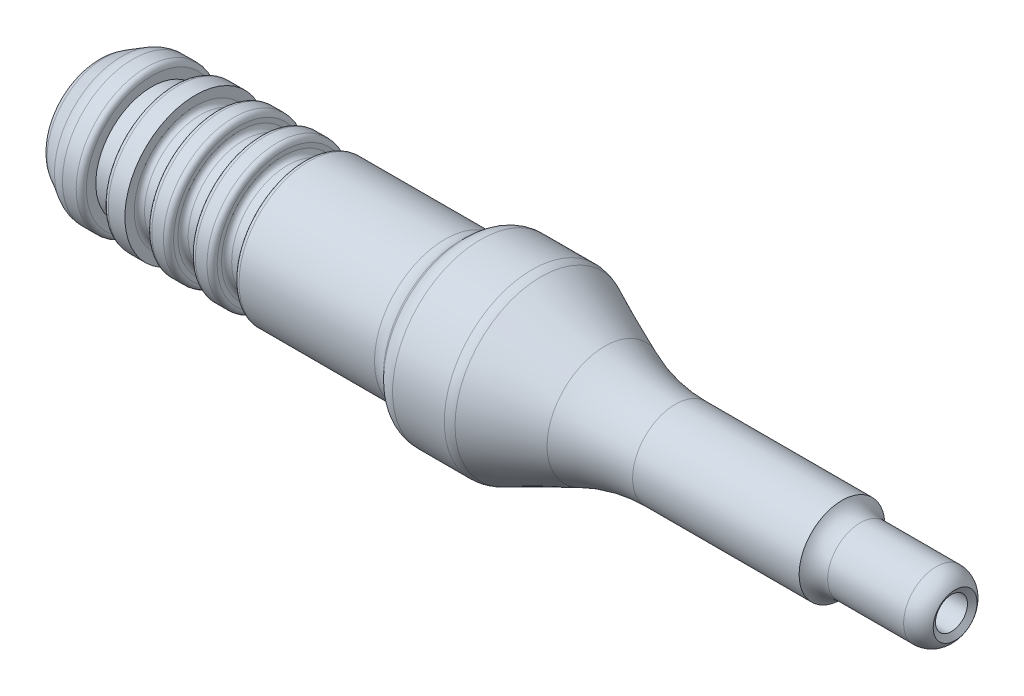
ISO-10303-21;
HEADER;
FILE_DESCRIPTION(('STEP AP214'),'2;1');
FILE_NAME('part.step','',(''),(''),'','','');
FILE_SCHEMA(('AUTOMOTIVE_DESIGN { 1 0 10303 214 1 1 1 1 }'));
ENDSEC;
DATA;
#1=APPLICATION_CONTEXT('core data for automotive mechanical design processes');
#2=APPLICATION_PROTOCOL_DEFINITION('international standard','automotive_design',2000,#1);
#3=PRODUCT_CONTEXT('',#1,'mechanical');
#4=PRODUCT('Part','Part','',(#3));
#5=PRODUCT_RELATED_PRODUCT_CATEGORY('part','',(#4));
#6=PRODUCT_DEFINITION_FORMATION('','',#4);
#7=PRODUCT_DEFINITION_CONTEXT('part definition',#1,'design');
#8=PRODUCT_DEFINITION('design','',#6,#7);
#9=PRODUCT_DEFINITION_SHAPE('','',#8);
#10=(LENGTH_UNIT() NAMED_UNIT(*) SI_UNIT(.MILLI.,.METRE.));
#11=(NAMED_UNIT(*) PLANE_ANGLE_UNIT() SI_UNIT($,.RADIAN.));
#12=(NAMED_UNIT(*) SI_UNIT($,.STERADIAN.) SOLID_ANGLE_UNIT());
#13=UNCERTAINTY_MEASURE_WITH_UNIT(LENGTH_MEASURE(1.E-05),#10,'distance_accuracy_value','');
#14=(GEOMETRIC_REPRESENTATION_CONTEXT(3) GLOBAL_UNCERTAINTY_ASSIGNED_CONTEXT((#13)) GLOBAL_UNIT_ASSIGNED_CONTEXT((#10,
#11,#12)) REPRESENTATION_CONTEXT('',''));
#15=CARTESIAN_POINT('',(0.,0.,0.));
#16=DIRECTION('',(0.,0.,1.));
#17=DIRECTION('',(1.,0.,0.));
#18=AXIS2_PLACEMENT_3D('',#15,#16,#17);
#19=CARTESIAN_POINT('',(0.,0.,0.));
#20=DIRECTION('',(-1.,0.,0.));
#21=DIRECTION('',(0.,0.,1.));
#22=AXIS2_PLACEMENT_3D('',#19,#20,#21);
#23=CYLINDRICAL_SURFACE('',#22,4.84790561913614);
#24=CARTESIAN_POINT('',(14.85,0.,0.));
#25=DIRECTION('',(1.,0.,0.));
#26=DIRECTION('',(0.,0.,-1.));
#27=AXIS2_PLACEMENT_3D('',#24,#25,#26);
#28=CIRCLE('',#27,4.84790561913614);
#29=CARTESIAN_POINT('',(14.85,0.,-4.84790561913614));
#30=VERTEX_POINT('',#29);
#31=EDGE_CURVE('E48',#30,#30,#28,.T.);
#32=ORIENTED_EDGE('',*,*,#31,.T.);
#33=EDGE_LOOP('',(#32));
#34=FACE_BOUND('',#33,.T.);
#35=CARTESIAN_POINT('',(24.1786796564404,0.,0.));
#36=DIRECTION('',(-1.,0.,0.));
#37=DIRECTION('',(0.,0.,1.));
#38=AXIS2_PLACEMENT_3D('',#35,#36,#37);
#39=CIRCLE('',#38,4.84790561913614);
#40=CARTESIAN_POINT('',(24.1786796564404,0.,4.84790561913614));
#41=VERTEX_POINT('',#40);
#42=EDGE_CURVE('E146',#41,#41,#39,.T.);
#43=ORIENTED_EDGE('',*,*,#42,.T.);
#44=EDGE_LOOP('',(#43));
#45=FACE_BOUND('',#44,.T.);
#46=ADVANCED_FACE('F33',(#34,#45),#23,.T.);
#47=CARTESIAN_POINT('',(26.,0.,0.));
#48=DIRECTION('',(1.,0.,0.));
#49=DIRECTION('',(0.,0.,-1.));
#50=AXIS2_PLACEMENT_3D('',#47,#48,#49);
#51=CONICAL_SURFACE('',#50,6.04790561913615,0.78539816339745);
#52=CARTESIAN_POINT('',(25.2393398282202,0.,0.));
#53=DIRECTION('',(1.,0.,0.));
#54=DIRECTION('',(0.,0.,-1.));
#55=AXIS2_PLACEMENT_3D('',#52,#53,#54);
#56=CIRCLE('',#55,5.28724544735633);
#57=CARTESIAN_POINT('',(25.2393398282202,0.,-5.28724544735633));
#58=VERTEX_POINT('',#57);
#59=EDGE_CURVE('E140',#58,#58,#56,.T.);
#60=ORIENTED_EDGE('',*,*,#59,.T.);
#61=EDGE_LOOP('',(#60));
#62=FACE_BOUND('',#61,.T.);
#63=CARTESIAN_POINT('',(25.5606601717798,0.,0.));
#64=DIRECTION('',(-1.,0.,0.));
#65=DIRECTION('',(0.,0.,1.));
#66=AXIS2_PLACEMENT_3D('',#63,#64,#65);
#67=CIRCLE('',#66,5.60856579091597);
#68=CARTESIAN_POINT('',(25.5606601717798,0.,5.60856579091597));
#69=VERTEX_POINT('',#68);
#70=EDGE_CURVE('E143',#69,#69,#67,.T.);
#71=ORIENTED_EDGE('',*,*,#70,.T.);
#72=EDGE_LOOP('',(#71));
#73=FACE_BOUND('',#72,.T.);
#74=ADVANCED_FACE('F207',(#62,#73),#51,.T.);
#75=CARTESIAN_POINT('',(0.,0.,0.));
#76=DIRECTION('',(-1.,0.,0.));
#77=DIRECTION('',(0.,0.,1.));
#78=AXIS2_PLACEMENT_3D('',#75,#76,#77);
#79=CYLINDRICAL_SURFACE('',#78,6.04790561913615);
#80=CARTESIAN_POINT('',(26.6213203435596,0.,0.));
#81=DIRECTION('',(1.,0.,0.));
#82=DIRECTION('',(0.,0.,-1.));
#83=AXIS2_PLACEMENT_3D('',#80,#81,#82);
#84=CIRCLE('',#83,6.04790561913615);
#85=CARTESIAN_POINT('',(26.6213203435596,0.,-6.04790561913615));
#86=VERTEX_POINT('',#85);
#87=EDGE_CURVE('E134',#86,#86,#84,.T.);
#88=ORIENTED_EDGE('',*,*,#87,.T.);
#89=EDGE_LOOP('',(#88));
#90=FACE_BOUND('',#89,.T.);
#91=CARTESIAN_POINT('',(30.182669802533,0.,0.));
#92=DIRECTION('',(1.,0.,0.));
#93=DIRECTION('',(0.,0.,-1.));
#94=AXIS2_PLACEMENT_3D('',#91,#92,#93);
#95=CIRCLE('',#94,6.04790561913615);
#96=CARTESIAN_POINT('',(30.182669802533,0.,-6.04790561913615));
#97=VERTEX_POINT('',#96);
#98=EDGE_CURVE('E137',#97,#97,#95,.F.);
#99=ORIENTED_EDGE('',*,*,#98,.T.);
#100=EDGE_LOOP('',(#99));
#101=FACE_BOUND('',#100,.T.);
#102=ADVANCED_FACE('F215',(#90,#101),#79,.T.);
#103=CARTESIAN_POINT('',(37.5,0.,0.));
#104=DIRECTION('',(-1.,0.,0.));
#105=DIRECTION('',(0.,0.,1.));
#106=AXIS2_PLACEMENT_3D('',#103,#104,#105);
#107=CONICAL_SURFACE('',#106,2.94739412510884,0.416959158301445);
#108=CARTESIAN_POINT('',(30.7901428223222,0.,0.));
#109=DIRECTION('',(1.,0.,0.));
#110=DIRECTION('',(0.,0.,-1.));
#111=AXIS2_PLACEMENT_3D('',#108,#109,#110);
#112=CIRCLE('',#111,5.91939259691907);
#113=CARTESIAN_POINT('',(30.7901428223222,0.,-5.91939259691907));
#114=VERTEX_POINT('',#113);
#115=EDGE_CURVE('E131',#114,#114,#112,.T.);
#116=ORIENTED_EDGE('',*,*,#115,.T.);
#117=EDGE_LOOP('',(#116));
#118=FACE_BOUND('',#117,.T.);
#119=CARTESIAN_POINT('',(35.1788574214223,0.,0.));
#120=DIRECTION('',(-1.,0.,0.));
#121=DIRECTION('',(0.,0.,1.));
#122=AXIS2_PLACEMENT_3D('',#119,#120,#121);
#123=CIRCLE('',#122,3.97549830284546);
#124=CARTESIAN_POINT('',(35.1788574214223,0.,3.97549830284546));
#125=VERTEX_POINT('',#124);
#126=EDGE_CURVE('E167',#125,#125,#123,.T.);
#127=ORIENTED_EDGE('',*,*,#126,.T.);
#128=EDGE_LOOP('',(#127));
#129=FACE_BOUND('',#128,.T.);
#130=ADVANCED_FACE('F291',(#118,#129),#107,.T.);
#131=CARTESIAN_POINT('',(0.,0.,0.));
#132=DIRECTION('',(-1.,0.,0.));
#133=DIRECTION('',(0.,0.,1.));
#134=AXIS2_PLACEMENT_3D('',#131,#132,#133);
#135=CYLINDRICAL_SURFACE('',#134,2.94739412510884);
#136=CARTESIAN_POINT('',(40.0386415797363,0.,0.));
#137=DIRECTION('',(-1.,0.,0.));
#138=DIRECTION('',(0.,0.,1.));
#139=AXIS2_PLACEMENT_3D('',#136,#137,#138);
#140=CIRCLE('',#139,2.94739412510884);
#141=CARTESIAN_POINT('',(40.0386415797363,0.,2.94739412510884));
#142=VERTEX_POINT('',#141);
#143=EDGE_CURVE('E164',#142,#142,#140,.F.);
#144=ORIENTED_EDGE('',*,*,#143,.T.);
#145=EDGE_LOOP('',(#144));
#146=FACE_BOUND('',#145,.T.);
#147=CARTESIAN_POINT('',(51.5,0.,0.));
#148=DIRECTION('',(-1.,0.,0.));
#149=DIRECTION('',(0.,0.,1.));
#150=AXIS2_PLACEMENT_3D('',#147,#148,#149);
#151=CIRCLE('',#150,2.94739412510884);
#152=CARTESIAN_POINT('',(51.5,0.,2.94739412510884));
#153=VERTEX_POINT('',#152);
#154=EDGE_CURVE('E170',#153,#153,#151,.T.);
#155=ORIENTED_EDGE('',*,*,#154,.T.);
#156=EDGE_LOOP('',(#155));
#157=FACE_BOUND('',#156,.T.);
#158=ADVANCED_FACE('F287',(#146,#157),#135,.T.);
#159=CARTESIAN_POINT('',(0.,0.,0.));
#160=DIRECTION('',(-1.,0.,0.));
#161=DIRECTION('',(0.,0.,1.));
#162=AXIS2_PLACEMENT_3D('',#159,#160,#161);
#163=CYLINDRICAL_SURFACE('',#162,2.25);
#164=CARTESIAN_POINT('',(52.7672110359329,0.,0.));
#165=DIRECTION('',(-1.,0.,0.));
#166=DIRECTION('',(0.,0.,1.));
#167=AXIS2_PLACEMENT_3D('',#164,#165,#166);
#168=CIRCLE('',#167,2.25);
#169=CARTESIAN_POINT('',(52.7672110359329,0.,2.25));
#170=VERTEX_POINT('',#169);
#171=EDGE_CURVE('E158',#170,#170,#168,.F.);
#172=ORIENTED_EDGE('',*,*,#171,.T.);
#173=EDGE_LOOP('',(#172));
#174=FACE_BOUND('',#173,.T.);
#175=CARTESIAN_POINT('',(57.9940454712813,0.,0.));
#176=DIRECTION('',(1.,0.,0.));
#177=DIRECTION('',(0.,0.,-1.));
#178=AXIS2_PLACEMENT_3D('',#175,#176,#177);
#179=CIRCLE('',#178,2.25);
#180=CARTESIAN_POINT('',(57.9940454712813,0.,-2.25));
#181=VERTEX_POINT('',#180);
#182=EDGE_CURVE('E161',#181,#181,#179,.F.);
#183=ORIENTED_EDGE('',*,*,#182,.T.);
#184=EDGE_LOOP('',(#183));
#185=FACE_BOUND('',#184,.T.);
#186=ADVANCED_FACE('F283',(#174,#185),#163,.T.);
#187=CARTESIAN_POINT('',(59.4526406858628,0.,0.));
#188=DIRECTION('',(1.,0.,0.));
#189=DIRECTION('',(0.,0.,-1.));
#190=AXIS2_PLACEMENT_3D('',#187,#188,#189);
#191=CYLINDRICAL_SURFACE('',#190,2.25);
#192=CARTESIAN_POINT('',(0.504621116444587,0.,0.));
#193=DIRECTION('',(-1.,0.,0.));
#194=DIRECTION('',(0.,0.,1.));
#195=AXIS2_PLACEMENT_3D('',#192,#193,#194);
#196=CIRCLE('',#195,2.25);
#197=CARTESIAN_POINT('',(0.504621116444587,0.,2.25));
#198=VERTEX_POINT('',#197);
#199=EDGE_CURVE('E125',#198,#198,#196,.T.);
#200=ORIENTED_EDGE('',*,*,#199,.T.);
#201=EDGE_LOOP('',(#200));
#202=FACE_BOUND('',#201,.T.);
#203=CARTESIAN_POINT('',(33.5,0.,0.));
#204=DIRECTION('',(1.,0.,0.));
#205=DIRECTION('',(0.,0.,-1.));
#206=AXIS2_PLACEMENT_3D('',#203,#204,#205);
#207=CIRCLE('',#206,2.25);
#208=CARTESIAN_POINT('',(33.5,0.,-2.25));
#209=VERTEX_POINT('',#208);
#210=EDGE_CURVE('E173',#209,#209,#207,.T.);
#211=ORIENTED_EDGE('',*,*,#210,.T.);
#212=EDGE_LOOP('',(#211));
#213=FACE_BOUND('',#212,.T.);
#214=ADVANCED_FACE('F279',(#202,#213),#191,.F.);
#215=CARTESIAN_POINT('',(35.4918584287042,0.,0.));
#216=DIRECTION('',(-1.,0.,0.));
#217=DIRECTION('',(0.,0.,1.));
#218=AXIS2_PLACEMENT_3D('',#215,#216,#217);
#219=CONICAL_SURFACE('',#218,1.1,0.5235987755983);
#220=ORIENTED_EDGE('',*,*,#210,.F.);
#221=EDGE_LOOP('',(#220));
#222=FACE_BOUND('',#221,.T.);
#223=CARTESIAN_POINT('',(35.4918584287042,0.,0.));
#224=DIRECTION('',(1.,0.,0.));
#225=DIRECTION('',(0.,0.,-1.));
#226=AXIS2_PLACEMENT_3D('',#223,#224,#225);
#227=CIRCLE('',#226,1.1);
#228=CARTESIAN_POINT('',(35.4918584287042,0.,-1.1));
#229=VERTEX_POINT('',#228);
#230=EDGE_CURVE('E176',#229,#229,#227,.T.);
#231=ORIENTED_EDGE('',*,*,#230,.T.);
#232=EDGE_LOOP('',(#231));
#233=FACE_BOUND('',#232,.T.);
#234=ADVANCED_FACE('F275',(#222,#233),#219,.F.);
#235=CARTESIAN_POINT('',(59.4526406858628,0.,0.));
#236=DIRECTION('',(1.,0.,0.));
#237=DIRECTION('',(0.,0.,-1.));
#238=AXIS2_PLACEMENT_3D('',#235,#236,#237);
#239=CYLINDRICAL_SURFACE('',#238,1.1);
#240=CARTESIAN_POINT('',(59.037954196618,0.,0.));
#241=DIRECTION('',(1.,0.,0.));
#242=DIRECTION('',(0.,0.,-1.));
#243=AXIS2_PLACEMENT_3D('',#240,#241,#242);
#244=CIRCLE('',#243,1.1);
#245=CARTESIAN_POINT('',(59.037954196618,0.,-1.1));
#246=VERTEX_POINT('',#245);
#247=EDGE_CURVE('E122',#246,#246,#244,.T.);
#248=ORIENTED_EDGE('',*,*,#247,.T.);
#249=EDGE_LOOP('',(#248));
#250=FACE_BOUND('',#249,.T.);
#251=ORIENTED_EDGE('',*,*,#230,.F.);
#252=EDGE_LOOP('',(#251));
#253=FACE_BOUND('',#252,.T.);
#254=ADVANCED_FACE('F234',(#250,#253),#239,.F.);
#255=CARTESIAN_POINT('',(2.3,0.,0.));
#256=DIRECTION('',(1.,0.,0.));
#257=DIRECTION('',(0.,0.,-1.));
#258=AXIS2_PLACEMENT_3D('',#255,#256,#257);
#259=CONICAL_SURFACE('',#258,4.84790561913614,0.5235987755983);
#260=CARTESIAN_POINT('',(1.95192378864669,0.,0.));
#261=DIRECTION('',(-1.,0.,0.));
#262=DIRECTION('',(0.,0.,1.));
#263=AXIS2_PLACEMENT_3D('',#260,#261,#262);
#264=CIRCLE('',#263,4.6469437248128);
#265=CARTESIAN_POINT('',(1.95192378864669,0.,4.6469437248128));
#266=VERTEX_POINT('',#265);
#267=EDGE_CURVE('E152',#266,#266,#264,.T.);
#268=ORIENTED_EDGE('',*,*,#267,.T.);
#269=EDGE_LOOP('',(#268));
#270=FACE_BOUND('',#269,.T.);
#271=CARTESIAN_POINT('',(0.749999999999998,0.,0.));
#272=DIRECTION('',(-1.,0.,0.));
#273=DIRECTION('',(0.,0.,1.));
#274=AXIS2_PLACEMENT_3D('',#271,#272,#273);
#275=CIRCLE('',#274,3.95301270189222);
#276=CARTESIAN_POINT('',(0.749999999999998,0.,3.95301270189222));
#277=VERTEX_POINT('',#276);
#278=EDGE_CURVE('E155',#277,#277,#275,.F.);
#279=ORIENTED_EDGE('',*,*,#278,.T.);
#280=EDGE_LOOP('',(#279));
#281=FACE_BOUND('',#280,.T.);
#282=ADVANCED_FACE('F226',(#270,#281),#259,.T.);
#283=CARTESIAN_POINT('',(3.65,0.,0.));
#284=DIRECTION('',(-1.,0.,0.));
#285=DIRECTION('',(0.,0.,1.));
#286=AXIS2_PLACEMENT_3D('',#283,#284,#285);
#287=CIRCLE('',#286,4.84790561913614);
#288=CARTESIAN_POINT('',(3.65,0.,4.84790561913614));
#289=VERTEX_POINT('',#288);
#290=EDGE_CURVE('E40',#289,#289,#287,.T.);
#291=ORIENTED_EDGE('',*,*,#290,.T.);
#292=EDGE_LOOP('',(#291));
#293=FACE_BOUND('',#292,.T.);
#294=CARTESIAN_POINT('',(2.70192378864669,0.,0.));
#295=DIRECTION('',(1.,0.,0.));
#296=DIRECTION('',(0.,0.,-1.));
#297=AXIS2_PLACEMENT_3D('',#294,#295,#296);
#298=CIRCLE('',#297,4.84790561913614);
#299=CARTESIAN_POINT('',(2.70192378864669,0.,-4.84790561913614));
#300=VERTEX_POINT('',#299);
#301=EDGE_CURVE('E149',#300,#300,#298,.T.);
#302=ORIENTED_EDGE('',*,*,#301,.T.);
#303=EDGE_LOOP('',(#302));
#304=FACE_BOUND('',#303,.T.);
#305=ADVANCED_FACE('F211',(#293,#304),#23,.T.);
#306=CARTESIAN_POINT('',(13.,4.84790561913614,0.));
#307=DIRECTION('',(-1.,0.,0.));
#308=DIRECTION('',(0.,0.,1.));
#309=AXIS2_PLACEMENT_3D('',#306,#307,#308);
#310=PLANE('',#309);
#311=CARTESIAN_POINT('',(13.,0.,0.));
#312=DIRECTION('',(-1.,0.,0.));
#313=DIRECTION('',(0.,0.,1.));
#314=AXIS2_PLACEMENT_3D('',#311,#312,#313);
#315=CIRCLE('',#314,4.49790561913615);
#316=CARTESIAN_POINT('',(13.,0.,4.49790561913615));
#317=VERTEX_POINT('',#316);
#318=EDGE_CURVE('E65',#317,#317,#315,.F.);
#319=ORIENTED_EDGE('',*,*,#318,.T.);
#320=EDGE_LOOP('',(#319));
#321=FACE_BOUND('',#320,.T.);
#322=CARTESIAN_POINT('',(13.,0.,0.));
#323=DIRECTION('',(-1.,0.,0.));
#324=DIRECTION('',(0.,0.,1.));
#325=AXIS2_PLACEMENT_3D('',#322,#323,#324);
#326=CIRCLE('',#325,4.19790561913614);
#327=CARTESIAN_POINT('',(13.,0.,4.19790561913614));
#328=VERTEX_POINT('',#327);
#329=EDGE_CURVE('E68',#328,#328,#326,.T.);
#330=ORIENTED_EDGE('',*,*,#329,.T.);
#331=EDGE_LOOP('',(#330));
#332=FACE_BOUND('',#331,.T.);
#333=ADVANCED_FACE('F225',(#321,#332),#310,.F.);
#334=CARTESIAN_POINT('',(59.4526406858628,0.,0.));
#335=DIRECTION('',(1.,0.,0.));
#336=DIRECTION('',(0.,0.,-1.));
#337=AXIS2_PLACEMENT_3D('',#334,#335,#336);
#338=CYLINDRICAL_SURFACE('',#337,3.84790561913614);
#339=CARTESIAN_POINT('',(13.35,0.,0.));
#340=DIRECTION('',(-1.,0.,0.));
#341=DIRECTION('',(0.,0.,1.));
#342=AXIS2_PLACEMENT_3D('',#339,#340,#341);
#343=CIRCLE('',#342,3.84790561913614);
#344=CARTESIAN_POINT('',(13.35,0.,3.84790561913614));
#345=VERTEX_POINT('',#344);
#346=EDGE_CURVE('E59',#345,#345,#343,.F.);
#347=ORIENTED_EDGE('',*,*,#346,.T.);
#348=EDGE_LOOP('',(#347));
#349=FACE_BOUND('',#348,.T.);
#350=CARTESIAN_POINT('',(14.15,0.,0.));
#351=DIRECTION('',(1.,0.,0.));
#352=DIRECTION('',(0.,0.,-1.));
#353=AXIS2_PLACEMENT_3D('',#350,#351,#352);
#354=CIRCLE('',#353,3.84790561913614);
#355=CARTESIAN_POINT('',(14.15,0.,-3.84790561913614));
#356=VERTEX_POINT('',#355);
#357=EDGE_CURVE('E62',#356,#356,#354,.F.);
#358=ORIENTED_EDGE('',*,*,#357,.T.);
#359=EDGE_LOOP('',(#358));
#360=FACE_BOUND('',#359,.T.);
#361=ADVANCED_FACE('F202',(#349,#360),#338,.T.);
#362=CARTESIAN_POINT('',(14.5,4.84790561913614,0.));
#363=DIRECTION('',(1.,0.,0.));
#364=DIRECTION('',(0.,0.,-1.));
#365=AXIS2_PLACEMENT_3D('',#362,#363,#364);
#366=PLANE('',#365);
#367=CARTESIAN_POINT('',(14.5,0.,0.));
#368=DIRECTION('',(1.,0.,0.));
#369=DIRECTION('',(0.,0.,-1.));
#370=AXIS2_PLACEMENT_3D('',#367,#368,#369);
#371=CIRCLE('',#370,4.19790561913614);
#372=CARTESIAN_POINT('',(14.5,0.,-4.19790561913614));
#373=VERTEX_POINT('',#372);
#374=EDGE_CURVE('E53',#373,#373,#371,.T.);
#375=ORIENTED_EDGE('',*,*,#374,.T.);
#376=EDGE_LOOP('',(#375));
#377=FACE_BOUND('',#376,.T.);
#378=CARTESIAN_POINT('',(14.5,0.,0.));
#379=DIRECTION('',(1.,0.,0.));
#380=DIRECTION('',(0.,0.,-1.));
#381=AXIS2_PLACEMENT_3D('',#378,#379,#380);
#382=CIRCLE('',#381,4.49790561913615);
#383=CARTESIAN_POINT('',(14.5,0.,-4.49790561913615));
#384=VERTEX_POINT('',#383);
#385=EDGE_CURVE('E56',#384,#384,#382,.F.);
#386=ORIENTED_EDGE('',*,*,#385,.T.);
#387=EDGE_LOOP('',(#386));
#388=FACE_BOUND('',#387,.T.);
#389=ADVANCED_FACE('F193',(#377,#388),#366,.F.);
#390=CARTESIAN_POINT('',(4.,4.84790561913614,0.));
#391=DIRECTION('',(-1.,0.,0.));
#392=DIRECTION('',(0.,0.,1.));
#393=AXIS2_PLACEMENT_3D('',#390,#391,#392);
#394=PLANE('',#393);
#395=CARTESIAN_POINT('',(4.,0.,0.));
#396=DIRECTION('',(-1.,0.,0.));
#397=DIRECTION('',(0.,0.,1.));
#398=AXIS2_PLACEMENT_3D('',#395,#396,#397);
#399=CIRCLE('',#398,4.49790561913615);
#400=CARTESIAN_POINT('',(4.,0.,4.49790561913615));
#401=VERTEX_POINT('',#400);
#402=EDGE_CURVE('E44',#401,#401,#399,.F.);
#403=ORIENTED_EDGE('',*,*,#402,.T.);
#404=EDGE_LOOP('',(#403));
#405=FACE_BOUND('',#404,.T.);
#406=CARTESIAN_POINT('',(4.,0.,0.));
#407=DIRECTION('',(1.,0.,0.));
#408=DIRECTION('',(0.,0.,-1.));
#409=AXIS2_PLACEMENT_3D('',#406,#407,#408);
#410=CIRCLE('',#409,3.84790561913615);
#411=CARTESIAN_POINT('',(4.,0.,-3.84790561913615));
#412=VERTEX_POINT('',#411);
#413=EDGE_CURVE('E179',#412,#412,#410,.T.);
#414=ORIENTED_EDGE('',*,*,#413,.F.);
#415=EDGE_LOOP('',(#414));
#416=FACE_BOUND('',#415,.T.);
#417=ADVANCED_FACE('F191',(#405,#416),#394,.F.);
#418=CARTESIAN_POINT('',(59.4526406858628,0.,0.));
#419=DIRECTION('',(1.,0.,0.));
#420=DIRECTION('',(0.,0.,-1.));
#421=AXIS2_PLACEMENT_3D('',#418,#419,#420);
#422=CYLINDRICAL_SURFACE('',#421,3.84790561913614);
#423=CARTESIAN_POINT('',(5.15,0.,0.));
#424=DIRECTION('',(1.,0.,0.));
#425=DIRECTION('',(0.,0.,-1.));
#426=AXIS2_PLACEMENT_3D('',#423,#424,#425);
#427=CIRCLE('',#426,3.84790561913614);
#428=CARTESIAN_POINT('',(5.15,0.,-3.84790561913614));
#429=VERTEX_POINT('',#428);
#430=EDGE_CURVE('E10',#429,#429,#427,.F.);
#431=ORIENTED_EDGE('',*,*,#430,.T.);
#432=EDGE_LOOP('',(#431));
#433=FACE_BOUND('',#432,.T.);
#434=ORIENTED_EDGE('',*,*,#413,.T.);
#435=EDGE_LOOP('',(#434));
#436=FACE_BOUND('',#435,.T.);
#437=ADVANCED_FACE('F189',(#433,#436),#422,.T.);
#438=CARTESIAN_POINT('',(5.5,4.84790561913614,0.));
#439=DIRECTION('',(1.,0.,0.));
#440=DIRECTION('',(0.,0.,-1.));
#441=AXIS2_PLACEMENT_3D('',#438,#439,#440);
#442=PLANE('',#441);
#443=CARTESIAN_POINT('',(5.5,0.,0.));
#444=DIRECTION('',(1.,0.,0.));
#445=DIRECTION('',(0.,0.,-1.));
#446=AXIS2_PLACEMENT_3D('',#443,#444,#445);
#447=CIRCLE('',#446,4.49790561913615);
#448=CARTESIAN_POINT('',(5.5,0.,-4.49790561913615));
#449=VERTEX_POINT('',#448);
#450=EDGE_CURVE('E110',#449,#449,#447,.F.);
#451=ORIENTED_EDGE('',*,*,#450,.T.);
#452=EDGE_LOOP('',(#451));
#453=FACE_BOUND('',#452,.T.);
#454=CARTESIAN_POINT('',(5.5,0.,0.));
#455=DIRECTION('',(1.,0.,0.));
#456=DIRECTION('',(0.,0.,-1.));
#457=AXIS2_PLACEMENT_3D('',#454,#455,#456);
#458=CIRCLE('',#457,4.19790561913615);
#459=CARTESIAN_POINT('',(5.5,0.,-4.19790561913615));
#460=VERTEX_POINT('',#459);
#461=EDGE_CURVE('E113',#460,#460,#458,.T.);
#462=ORIENTED_EDGE('',*,*,#461,.T.);
#463=EDGE_LOOP('',(#462));
#464=FACE_BOUND('',#463,.T.);
#465=ADVANCED_FACE('F200',(#453,#464),#442,.F.);
#466=CARTESIAN_POINT('',(11.85,0.,0.));
#467=DIRECTION('',(1.,0.,0.));
#468=DIRECTION('',(0.,0.,-1.));
#469=AXIS2_PLACEMENT_3D('',#466,#467,#468);
#470=CIRCLE('',#469,4.84790561913614);
#471=CARTESIAN_POINT('',(11.85,0.,-4.84790561913614));
#472=VERTEX_POINT('',#471);
#473=EDGE_CURVE('E74',#472,#472,#470,.T.);
#474=ORIENTED_EDGE('',*,*,#473,.T.);
#475=EDGE_LOOP('',(#474));
#476=FACE_BOUND('',#475,.T.);
#477=CARTESIAN_POINT('',(12.65,0.,0.));
#478=DIRECTION('',(-1.,0.,0.));
#479=DIRECTION('',(0.,0.,1.));
#480=AXIS2_PLACEMENT_3D('',#477,#478,#479);
#481=CIRCLE('',#480,4.84790561913614);
#482=CARTESIAN_POINT('',(12.65,0.,4.84790561913614));
#483=VERTEX_POINT('',#482);
#484=EDGE_CURVE('E77',#483,#483,#481,.T.);
#485=ORIENTED_EDGE('',*,*,#484,.T.);
#486=EDGE_LOOP('',(#485));
#487=FACE_BOUND('',#486,.T.);
#488=ADVANCED_FACE('F210',(#476,#487),#23,.T.);
#489=CARTESIAN_POINT('',(10.,4.84790561913614,0.));
#490=DIRECTION('',(-1.,0.,0.));
#491=DIRECTION('',(0.,0.,1.));
#492=AXIS2_PLACEMENT_3D('',#489,#490,#491);
#493=PLANE('',#492);
#494=CARTESIAN_POINT('',(10.,0.,0.));
#495=DIRECTION('',(-1.,0.,0.));
#496=DIRECTION('',(0.,0.,1.));
#497=AXIS2_PLACEMENT_3D('',#494,#495,#496);
#498=CIRCLE('',#497,4.19790561913614);
#499=CARTESIAN_POINT('',(10.,0.,4.19790561913614));
#500=VERTEX_POINT('',#499);
#501=EDGE_CURVE('E101',#500,#500,#498,.T.);
#502=ORIENTED_EDGE('',*,*,#501,.T.);
#503=EDGE_LOOP('',(#502));
#504=FACE_BOUND('',#503,.T.);
#505=CARTESIAN_POINT('',(10.,0.,0.));
#506=DIRECTION('',(-1.,0.,0.));
#507=DIRECTION('',(0.,0.,1.));
#508=AXIS2_PLACEMENT_3D('',#505,#506,#507);
#509=CIRCLE('',#508,4.49790561913615);
#510=CARTESIAN_POINT('',(10.,0.,4.49790561913615));
#511=VERTEX_POINT('',#510);
#512=EDGE_CURVE('E104',#511,#511,#509,.F.);
#513=ORIENTED_EDGE('',*,*,#512,.T.);
#514=EDGE_LOOP('',(#513));
#515=FACE_BOUND('',#514,.T.);
#516=ADVANCED_FACE('F221',(#504,#515),#493,.F.);
#517=CARTESIAN_POINT('',(59.4526406858628,0.,0.));
#518=DIRECTION('',(1.,0.,0.));
#519=DIRECTION('',(0.,0.,-1.));
#520=AXIS2_PLACEMENT_3D('',#517,#518,#519);
#521=CYLINDRICAL_SURFACE('',#520,3.84790561913614);
#522=CARTESIAN_POINT('',(10.35,0.,0.));
#523=DIRECTION('',(-1.,0.,0.));
#524=DIRECTION('',(0.,0.,1.));
#525=AXIS2_PLACEMENT_3D('',#522,#523,#524);
#526=CIRCLE('',#525,3.84790561913614);
#527=CARTESIAN_POINT('',(10.35,0.,3.84790561913614));
#528=VERTEX_POINT('',#527);
#529=EDGE_CURVE('E107',#528,#528,#526,.F.);
#530=ORIENTED_EDGE('',*,*,#529,.T.);
#531=EDGE_LOOP('',(#530));
#532=FACE_BOUND('',#531,.T.);
#533=CARTESIAN_POINT('',(11.5,0.,0.));
#534=DIRECTION('',(1.,0.,0.));
#535=DIRECTION('',(0.,0.,-1.));
#536=AXIS2_PLACEMENT_3D('',#533,#534,#535);
#537=CIRCLE('',#536,3.84790561913614);
#538=CARTESIAN_POINT('',(11.5,0.,-3.84790561913614));
#539=VERTEX_POINT('',#538);
#540=EDGE_CURVE('E180',#539,#539,#537,.T.);
#541=ORIENTED_EDGE('',*,*,#540,.F.);
#542=EDGE_LOOP('',(#541));
#543=FACE_BOUND('',#542,.T.);
#544=ADVANCED_FACE('F246',(#532,#543),#521,.T.);
#545=CARTESIAN_POINT('',(11.5,4.84790561913614,0.));
#546=DIRECTION('',(1.,0.,0.));
#547=DIRECTION('',(0.,0.,-1.));
#548=AXIS2_PLACEMENT_3D('',#545,#546,#547);
#549=PLANE('',#548);
#550=CARTESIAN_POINT('',(11.5,0.,0.));
#551=DIRECTION('',(1.,0.,0.));
#552=DIRECTION('',(0.,0.,-1.));
#553=AXIS2_PLACEMENT_3D('',#550,#551,#552);
#554=CIRCLE('',#553,4.49790561913615);
#555=CARTESIAN_POINT('',(11.5,0.,-4.49790561913615));
#556=VERTEX_POINT('',#555);
#557=EDGE_CURVE('E71',#556,#556,#554,.F.);
#558=ORIENTED_EDGE('',*,*,#557,.T.);
#559=EDGE_LOOP('',(#558));
#560=FACE_BOUND('',#559,.T.);
#561=ORIENTED_EDGE('',*,*,#540,.T.);
#562=EDGE_LOOP('',(#561));
#563=FACE_BOUND('',#562,.T.);
#564=ADVANCED_FACE('F238',(#560,#563),#549,.F.);
#565=CARTESIAN_POINT('',(5.85,0.,0.));
#566=DIRECTION('',(1.,0.,0.));
#567=DIRECTION('',(0.,0.,-1.));
#568=AXIS2_PLACEMENT_3D('',#565,#566,#567);
#569=CIRCLE('',#568,4.84790561913614);
#570=CARTESIAN_POINT('',(5.85,0.,-4.84790561913614));
#571=VERTEX_POINT('',#570);
#572=EDGE_CURVE('E116',#571,#571,#569,.T.);
#573=ORIENTED_EDGE('',*,*,#572,.T.);
#574=EDGE_LOOP('',(#573));
#575=FACE_BOUND('',#574,.T.);
#576=CARTESIAN_POINT('',(7.00000000000001,0.,0.));
#577=DIRECTION('',(1.,0.,0.));
#578=DIRECTION('',(0.,0.,-1.));
#579=AXIS2_PLACEMENT_3D('',#576,#577,#578);
#580=CIRCLE('',#579,4.84790561913614);
#581=CARTESIAN_POINT('',(7.00000000000001,0.,-4.84790561913614));
#582=VERTEX_POINT('',#581);
#583=EDGE_CURVE('E183',#582,#582,#580,.T.);
#584=ORIENTED_EDGE('',*,*,#583,.F.);
#585=EDGE_LOOP('',(#584));
#586=FACE_BOUND('',#585,.T.);
#587=ADVANCED_FACE('F227',(#575,#586),#23,.T.);
#588=CARTESIAN_POINT('',(8.85,0.,0.));
#589=DIRECTION('',(1.,0.,0.));
#590=DIRECTION('',(0.,0.,-1.));
#591=AXIS2_PLACEMENT_3D('',#588,#589,#590);
#592=CIRCLE('',#591,4.84790561913614);
#593=CARTESIAN_POINT('',(8.85,0.,-4.84790561913614));
#594=VERTEX_POINT('',#593);
#595=EDGE_CURVE('E80',#594,#594,#592,.T.);
#596=ORIENTED_EDGE('',*,*,#595,.T.);
#597=EDGE_LOOP('',(#596));
#598=FACE_BOUND('',#597,.T.);
#599=CARTESIAN_POINT('',(9.65000000000001,0.,0.));
#600=DIRECTION('',(-1.,0.,0.));
#601=DIRECTION('',(0.,0.,1.));
#602=AXIS2_PLACEMENT_3D('',#599,#600,#601);
#603=CIRCLE('',#602,4.84790561913614);
#604=CARTESIAN_POINT('',(9.65000000000001,0.,4.84790561913614));
#605=VERTEX_POINT('',#604);
#606=EDGE_CURVE('E83',#605,#605,#603,.T.);
#607=ORIENTED_EDGE('',*,*,#606,.T.);
#608=EDGE_LOOP('',(#607));
#609=FACE_BOUND('',#608,.T.);
#610=ADVANCED_FACE('F223',(#598,#609),#23,.T.);
#611=CARTESIAN_POINT('',(7.,4.84790561913614,0.));
#612=DIRECTION('',(-1.,0.,0.));
#613=DIRECTION('',(0.,0.,1.));
#614=AXIS2_PLACEMENT_3D('',#611,#612,#613);
#615=PLANE('',#614);
#616=CARTESIAN_POINT('',(7.,0.,0.));
#617=DIRECTION('',(-1.,0.,0.));
#618=DIRECTION('',(0.,0.,1.));
#619=AXIS2_PLACEMENT_3D('',#616,#617,#618);
#620=CIRCLE('',#619,4.19790561913614);
#621=CARTESIAN_POINT('',(7.,0.,4.19790561913614));
#622=VERTEX_POINT('',#621);
#623=EDGE_CURVE('E92',#622,#622,#620,.T.);
#624=ORIENTED_EDGE('',*,*,#623,.T.);
#625=EDGE_LOOP('',(#624));
#626=FACE_BOUND('',#625,.T.);
#627=ORIENTED_EDGE('',*,*,#583,.T.);
#628=EDGE_LOOP('',(#627));
#629=FACE_BOUND('',#628,.T.);
#630=ADVANCED_FACE('F244',(#626,#629),#615,.F.);
#631=CARTESIAN_POINT('',(59.4526406858628,0.,0.));
#632=DIRECTION('',(1.,0.,0.));
#633=DIRECTION('',(0.,0.,-1.));
#634=AXIS2_PLACEMENT_3D('',#631,#632,#633);
#635=CYLINDRICAL_SURFACE('',#634,3.84790561913614);
#636=CARTESIAN_POINT('',(7.35,0.,0.));
#637=DIRECTION('',(-1.,0.,0.));
#638=DIRECTION('',(0.,0.,1.));
#639=AXIS2_PLACEMENT_3D('',#636,#637,#638);
#640=CIRCLE('',#639,3.84790561913614);
#641=CARTESIAN_POINT('',(7.35,0.,3.84790561913614));
#642=VERTEX_POINT('',#641);
#643=EDGE_CURVE('E95',#642,#642,#640,.F.);
#644=ORIENTED_EDGE('',*,*,#643,.T.);
#645=EDGE_LOOP('',(#644));
#646=FACE_BOUND('',#645,.T.);
#647=CARTESIAN_POINT('',(8.15,0.,0.));
#648=DIRECTION('',(1.,0.,0.));
#649=DIRECTION('',(0.,0.,-1.));
#650=AXIS2_PLACEMENT_3D('',#647,#648,#649);
#651=CIRCLE('',#650,3.84790561913614);
#652=CARTESIAN_POINT('',(8.15,0.,-3.84790561913614));
#653=VERTEX_POINT('',#652);
#654=EDGE_CURVE('E98',#653,#653,#651,.F.);
#655=ORIENTED_EDGE('',*,*,#654,.T.);
#656=EDGE_LOOP('',(#655));
#657=FACE_BOUND('',#656,.T.);
#658=ADVANCED_FACE('F254',(#646,#657),#635,.T.);
#659=CARTESIAN_POINT('',(8.5,4.84790561913614,0.));
#660=DIRECTION('',(1.,0.,0.));
#661=DIRECTION('',(0.,0.,-1.));
#662=AXIS2_PLACEMENT_3D('',#659,#660,#661);
#663=PLANE('',#662);
#664=CARTESIAN_POINT('',(8.5,0.,0.));
#665=DIRECTION('',(1.,0.,0.));
#666=DIRECTION('',(0.,0.,-1.));
#667=AXIS2_PLACEMENT_3D('',#664,#665,#666);
#668=CIRCLE('',#667,4.19790561913614);
#669=CARTESIAN_POINT('',(8.5,0.,-4.19790561913614));
#670=VERTEX_POINT('',#669);
#671=EDGE_CURVE('E86',#670,#670,#668,.T.);
#672=ORIENTED_EDGE('',*,*,#671,.T.);
#673=EDGE_LOOP('',(#672));
#674=FACE_BOUND('',#673,.T.);
#675=CARTESIAN_POINT('',(8.5,0.,0.));
#676=DIRECTION('',(1.,0.,0.));
#677=DIRECTION('',(0.,0.,-1.));
#678=AXIS2_PLACEMENT_3D('',#675,#676,#677);
#679=CIRCLE('',#678,4.49790561913615);
#680=CARTESIAN_POINT('',(8.5,0.,-4.49790561913615));
#681=VERTEX_POINT('',#680);
#682=EDGE_CURVE('E89',#681,#681,#679,.F.);
#683=ORIENTED_EDGE('',*,*,#682,.T.);
#684=EDGE_LOOP('',(#683));
#685=FACE_BOUND('',#684,.T.);
#686=ADVANCED_FACE('F260',(#674,#685),#663,.F.);
#687=CARTESIAN_POINT('',(40.0386415797363,0.,0.));
#688=DIRECTION('',(-1.,0.,0.));
#689=DIRECTION('',(0.,0.,1.));
#690=AXIS2_PLACEMENT_3D('',#687,#688,#689);
#691=TOROIDAL_SURFACE('',#690,14.9473941251088,12.);
#692=ORIENTED_EDGE('',*,*,#143,.F.);
#693=EDGE_LOOP('',(#692));
#694=FACE_BOUND('',#693,.T.);
#695=ORIENTED_EDGE('',*,*,#126,.F.);
#696=EDGE_LOOP('',(#695));
#697=FACE_BOUND('',#696,.T.);
#698=ADVANCED_FACE('F452',(#694,#697),#691,.F.);
#699=CARTESIAN_POINT('',(52.7672110359329,0.,0.));
#700=DIRECTION('',(-1.,0.,0.));
#701=DIRECTION('',(0.,0.,1.));
#702=AXIS2_PLACEMENT_3D('',#699,#700,#701);
#703=TOROIDAL_SURFACE('',#702,3.75,1.5);
#704=ORIENTED_EDGE('',*,*,#171,.F.);
#705=EDGE_LOOP('',(#704));
#706=FACE_BOUND('',#705,.T.);
#707=ORIENTED_EDGE('',*,*,#154,.F.);
#708=EDGE_LOOP('',(#707));
#709=FACE_BOUND('',#708,.T.);
#710=ADVANCED_FACE('F582',(#706,#709),#703,.F.);
#711=CARTESIAN_POINT('',(2.70192378864669,0.,0.));
#712=DIRECTION('',(1.,0.,0.));
#713=DIRECTION('',(0.,0.,-1.));
#714=AXIS2_PLACEMENT_3D('',#711,#712,#713);
#715=TOROIDAL_SURFACE('',#714,3.34790561913614,1.5);
#716=ORIENTED_EDGE('',*,*,#301,.F.);
#717=EDGE_LOOP('',(#716));
#718=FACE_BOUND('',#717,.T.);
#719=ORIENTED_EDGE('',*,*,#267,.F.);
#720=EDGE_LOOP('',(#719));
#721=FACE_BOUND('',#720,.T.);
#722=ADVANCED_FACE('F573',(#718,#721),#715,.T.);
#723=CARTESIAN_POINT('',(24.1786796564404,0.,0.));
#724=DIRECTION('',(-1.,0.,0.));
#725=DIRECTION('',(0.,0.,1.));
#726=AXIS2_PLACEMENT_3D('',#723,#724,#725);
#727=TOROIDAL_SURFACE('',#726,6.34790561913614,1.5);
#728=ORIENTED_EDGE('',*,*,#59,.F.);
#729=EDGE_LOOP('',(#728));
#730=FACE_BOUND('',#729,.T.);
#731=ORIENTED_EDGE('',*,*,#42,.F.);
#732=EDGE_LOOP('',(#731));
#733=FACE_BOUND('',#732,.T.);
#734=ADVANCED_FACE('F317',(#730,#733),#727,.F.);
#735=CARTESIAN_POINT('',(26.6213203435596,0.,0.));
#736=DIRECTION('',(1.,0.,0.));
#737=DIRECTION('',(0.,0.,-1.));
#738=AXIS2_PLACEMENT_3D('',#735,#736,#737);
#739=TOROIDAL_SURFACE('',#738,4.54790561913615,1.5);
#740=ORIENTED_EDGE('',*,*,#87,.F.);
#741=EDGE_LOOP('',(#740));
#742=FACE_BOUND('',#741,.T.);
#743=ORIENTED_EDGE('',*,*,#70,.F.);
#744=EDGE_LOOP('',(#743));
#745=FACE_BOUND('',#744,.T.);
#746=ADVANCED_FACE('F307',(#742,#745),#739,.T.);
#747=CARTESIAN_POINT('',(30.182669802533,0.,0.));
#748=DIRECTION('',(1.,0.,0.));
#749=DIRECTION('',(0.,0.,-1.));
#750=AXIS2_PLACEMENT_3D('',#747,#748,#749);
#751=TOROIDAL_SURFACE('',#750,4.54790561913615,1.5);
#752=ORIENTED_EDGE('',*,*,#115,.F.);
#753=EDGE_LOOP('',(#752));
#754=FACE_BOUND('',#753,.T.);
#755=ORIENTED_EDGE('',*,*,#98,.F.);
#756=EDGE_LOOP('',(#755));
#757=FACE_BOUND('',#756,.T.);
#758=ADVANCED_FACE('F304',(#754,#757),#751,.T.);
#759=CARTESIAN_POINT('',(1.5,0.,0.));
#760=DIRECTION('',(1.,0.,0.));
#761=DIRECTION('',(0.,0.,-1.));
#762=AXIS2_PLACEMENT_3D('',#759,#760,#761);
#763=TOROIDAL_SURFACE('',#762,2.65397459621556,1.5);
#764=CARTESIAN_POINT('',(0.00693167466686096,0.,0.));
#765=DIRECTION('',(1.,0.,0.));
#766=DIRECTION('',(0.,0.,-1.));
#767=AXIS2_PLACEMENT_3D('',#764,#765,#766);
#768=CIRCLE('',#767,2.79801270189223);
#769=CARTESIAN_POINT('',(0.00693167466686096,0.,-2.79801270189223));
#770=VERTEX_POINT('',#769);
#771=EDGE_CURVE('E128',#770,#770,#768,.T.);
#772=ORIENTED_EDGE('',*,*,#771,.T.);
#773=EDGE_LOOP('',(#772));
#774=FACE_BOUND('',#773,.T.);
#775=ORIENTED_EDGE('',*,*,#278,.F.);
#776=EDGE_LOOP('',(#775));
#777=FACE_BOUND('',#776,.T.);
#778=ADVANCED_FACE('F306',(#774,#777),#763,.T.);
#779=CARTESIAN_POINT('',(57.9940454712813,0.,0.));
#780=DIRECTION('',(1.,0.,0.));
#781=DIRECTION('',(0.,0.,-1.));
#782=AXIS2_PLACEMENT_3D('',#779,#780,#781);
#783=DEGENERATE_TOROIDAL_SURFACE('',#782,0.75,1.5,.T.);
#784=CARTESIAN_POINT('',(59.2882411217387,0.,0.));
#785=DIRECTION('',(-1.,0.,0.));
#786=DIRECTION('',(0.,0.,1.));
#787=AXIS2_PLACEMENT_3D('',#784,#785,#786);
#788=CIRCLE('',#787,1.50832553585996);
#789=CARTESIAN_POINT('',(59.2882411217387,0.,1.50832553585996));
#790=VERTEX_POINT('',#789);
#791=EDGE_CURVE('E119',#790,#790,#788,.T.);
#792=ORIENTED_EDGE('',*,*,#791,.T.);
#793=EDGE_LOOP('',(#792));
#794=FACE_BOUND('',#793,.T.);
#795=ORIENTED_EDGE('',*,*,#182,.F.);
#796=EDGE_LOOP('',(#795));
#797=FACE_BOUND('',#796,.T.);
#798=ADVANCED_FACE('F314',(#794,#797),#783,.T.);
#799=CARTESIAN_POINT('',(0.00693167466686985,0.,0.));
#800=DIRECTION('',(-1.,0.,0.));
#801=DIRECTION('',(0.,0.,1.));
#802=AXIS2_PLACEMENT_3D('',#799,#800,#801);
#803=CONICAL_SURFACE('',#802,2.79801270189223,0.833484959696087);
#804=ORIENTED_EDGE('',*,*,#199,.F.);
#805=EDGE_LOOP('',(#804));
#806=FACE_BOUND('',#805,.T.);
#807=ORIENTED_EDGE('',*,*,#771,.F.);
#808=EDGE_LOOP('',(#807));
#809=FACE_BOUND('',#808,.T.);
#810=ADVANCED_FACE('F325',(#806,#809),#803,.F.);
#811=CARTESIAN_POINT('',(59.037954196618,0.,0.));
#812=DIRECTION('',(1.,0.,0.));
#813=DIRECTION('',(0.,0.,-1.));
#814=AXIS2_PLACEMENT_3D('',#811,#812,#813);
#815=CONICAL_SURFACE('',#814,1.1,1.02090240011836);
#816=ORIENTED_EDGE('',*,*,#791,.F.);
#817=EDGE_LOOP('',(#816));
#818=FACE_BOUND('',#817,.T.);
#819=ORIENTED_EDGE('',*,*,#247,.F.);
#820=EDGE_LOOP('',(#819));
#821=FACE_BOUND('',#820,.T.);
#822=ADVANCED_FACE('F333',(#818,#821),#815,.F.);
#823=CARTESIAN_POINT('',(5.85,0.,0.));
#824=DIRECTION('',(1.,0.,0.));
#825=DIRECTION('',(0.,0.,-1.));
#826=AXIS2_PLACEMENT_3D('',#823,#824,#825);
#827=TOROIDAL_SURFACE('',#826,4.49790561913615,0.35);
#828=ORIENTED_EDGE('',*,*,#450,.F.);
#829=EDGE_LOOP('',(#828));
#830=FACE_BOUND('',#829,.T.);
#831=ORIENTED_EDGE('',*,*,#572,.F.);
#832=EDGE_LOOP('',(#831));
#833=FACE_BOUND('',#832,.T.);
#834=ADVANCED_FACE('F339',(#830,#833),#827,.T.);
#835=CARTESIAN_POINT('',(10.35,0.,0.));
#836=DIRECTION('',(-1.,0.,0.));
#837=DIRECTION('',(0.,0.,1.));
#838=AXIS2_PLACEMENT_3D('',#835,#836,#837);
#839=TOROIDAL_SURFACE('',#838,4.19790561913614,0.35);
#840=ORIENTED_EDGE('',*,*,#501,.F.);
#841=EDGE_LOOP('',(#840));
#842=FACE_BOUND('',#841,.T.);
#843=ORIENTED_EDGE('',*,*,#529,.F.);
#844=EDGE_LOOP('',(#843));
#845=FACE_BOUND('',#844,.T.);
#846=ADVANCED_FACE('F343',(#842,#845),#839,.F.);
#847=CARTESIAN_POINT('',(7.35,0.,0.));
#848=DIRECTION('',(-1.,0.,0.));
#849=DIRECTION('',(0.,0.,1.));
#850=AXIS2_PLACEMENT_3D('',#847,#848,#849);
#851=TOROIDAL_SURFACE('',#850,4.19790561913614,0.35);
#852=ORIENTED_EDGE('',*,*,#623,.F.);
#853=EDGE_LOOP('',(#852));
#854=FACE_BOUND('',#853,.T.);
#855=ORIENTED_EDGE('',*,*,#643,.F.);
#856=EDGE_LOOP('',(#855));
#857=FACE_BOUND('',#856,.T.);
#858=ADVANCED_FACE('F347',(#854,#857),#851,.F.);
#859=CARTESIAN_POINT('',(8.15,0.,0.));
#860=DIRECTION('',(1.,0.,0.));
#861=DIRECTION('',(0.,0.,-1.));
#862=AXIS2_PLACEMENT_3D('',#859,#860,#861);
#863=TOROIDAL_SURFACE('',#862,4.19790561913614,0.35);
#864=ORIENTED_EDGE('',*,*,#654,.F.);
#865=EDGE_LOOP('',(#864));
#866=FACE_BOUND('',#865,.T.);
#867=ORIENTED_EDGE('',*,*,#671,.F.);
#868=EDGE_LOOP('',(#867));
#869=FACE_BOUND('',#868,.T.);
#870=ADVANCED_FACE('F351',(#866,#869),#863,.F.);
#871=CARTESIAN_POINT('',(8.85,0.,0.));
#872=DIRECTION('',(1.,0.,0.));
#873=DIRECTION('',(0.,0.,-1.));
#874=AXIS2_PLACEMENT_3D('',#871,#872,#873);
#875=TOROIDAL_SURFACE('',#874,4.49790561913615,0.35);
#876=ORIENTED_EDGE('',*,*,#682,.F.);
#877=EDGE_LOOP('',(#876));
#878=FACE_BOUND('',#877,.T.);
#879=ORIENTED_EDGE('',*,*,#595,.F.);
#880=EDGE_LOOP('',(#879));
#881=FACE_BOUND('',#880,.T.);
#882=ADVANCED_FACE('F355',(#878,#881),#875,.T.);
#883=CARTESIAN_POINT('',(9.65000000000001,0.,0.));
#884=DIRECTION('',(-1.,0.,0.));
#885=DIRECTION('',(0.,0.,1.));
#886=AXIS2_PLACEMENT_3D('',#883,#884,#885);
#887=TOROIDAL_SURFACE('',#886,4.49790561913615,0.35);
#888=ORIENTED_EDGE('',*,*,#606,.F.);
#889=EDGE_LOOP('',(#888));
#890=FACE_BOUND('',#889,.T.);
#891=ORIENTED_EDGE('',*,*,#512,.F.);
#892=EDGE_LOOP('',(#891));
#893=FACE_BOUND('',#892,.T.);
#894=ADVANCED_FACE('F359',(#890,#893),#887,.T.);
#895=CARTESIAN_POINT('',(11.85,0.,0.));
#896=DIRECTION('',(1.,0.,0.));
#897=DIRECTION('',(0.,0.,-1.));
#898=AXIS2_PLACEMENT_3D('',#895,#896,#897);
#899=TOROIDAL_SURFACE('',#898,4.49790561913615,0.35);
#900=ORIENTED_EDGE('',*,*,#557,.F.);
#901=EDGE_LOOP('',(#900));
#902=FACE_BOUND('',#901,.T.);
#903=ORIENTED_EDGE('',*,*,#473,.F.);
#904=EDGE_LOOP('',(#903));
#905=FACE_BOUND('',#904,.T.);
#906=ADVANCED_FACE('F363',(#902,#905),#899,.T.);
#907=CARTESIAN_POINT('',(12.65,0.,0.));
#908=DIRECTION('',(-1.,0.,0.));
#909=DIRECTION('',(0.,0.,1.));
#910=AXIS2_PLACEMENT_3D('',#907,#908,#909);
#911=TOROIDAL_SURFACE('',#910,4.49790561913615,0.35);
#912=ORIENTED_EDGE('',*,*,#484,.F.);
#913=EDGE_LOOP('',(#912));
#914=FACE_BOUND('',#913,.T.);
#915=ORIENTED_EDGE('',*,*,#318,.F.);
#916=EDGE_LOOP('',(#915));
#917=FACE_BOUND('',#916,.T.);
#918=ADVANCED_FACE('F367',(#914,#917),#911,.T.);
#919=CARTESIAN_POINT('',(13.35,0.,0.));
#920=DIRECTION('',(-1.,0.,0.));
#921=DIRECTION('',(0.,0.,1.));
#922=AXIS2_PLACEMENT_3D('',#919,#920,#921);
#923=TOROIDAL_SURFACE('',#922,4.19790561913614,0.35);
#924=ORIENTED_EDGE('',*,*,#329,.F.);
#925=EDGE_LOOP('',(#924));
#926=FACE_BOUND('',#925,.T.);
#927=ORIENTED_EDGE('',*,*,#346,.F.);
#928=EDGE_LOOP('',(#927));
#929=FACE_BOUND('',#928,.T.);
#930=ADVANCED_FACE('F371',(#926,#929),#923,.F.);
#931=CARTESIAN_POINT('',(14.15,0.,0.));
#932=DIRECTION('',(1.,0.,0.));
#933=DIRECTION('',(0.,0.,-1.));
#934=AXIS2_PLACEMENT_3D('',#931,#932,#933);
#935=TOROIDAL_SURFACE('',#934,4.19790561913614,0.35);
#936=ORIENTED_EDGE('',*,*,#357,.F.);
#937=EDGE_LOOP('',(#936));
#938=FACE_BOUND('',#937,.T.);
#939=ORIENTED_EDGE('',*,*,#374,.F.);
#940=EDGE_LOOP('',(#939));
#941=FACE_BOUND('',#940,.T.);
#942=ADVANCED_FACE('F375',(#938,#941),#935,.F.);
#943=CARTESIAN_POINT('',(14.85,0.,0.));
#944=DIRECTION('',(1.,0.,0.));
#945=DIRECTION('',(0.,0.,-1.));
#946=AXIS2_PLACEMENT_3D('',#943,#944,#945);
#947=TOROIDAL_SURFACE('',#946,4.49790561913615,0.35);
#948=ORIENTED_EDGE('',*,*,#385,.F.);
#949=EDGE_LOOP('',(#948));
#950=FACE_BOUND('',#949,.T.);
#951=ORIENTED_EDGE('',*,*,#31,.F.);
#952=EDGE_LOOP('',(#951));
#953=FACE_BOUND('',#952,.T.);
#954=ADVANCED_FACE('F379',(#950,#953),#947,.T.);
#955=CARTESIAN_POINT('',(3.65,0.,0.));
#956=DIRECTION('',(-1.,0.,0.));
#957=DIRECTION('',(0.,0.,1.));
#958=AXIS2_PLACEMENT_3D('',#955,#956,#957);
#959=TOROIDAL_SURFACE('',#958,4.49790561913615,0.35);
#960=ORIENTED_EDGE('',*,*,#290,.F.);
#961=EDGE_LOOP('',(#960));
#962=FACE_BOUND('',#961,.T.);
#963=ORIENTED_EDGE('',*,*,#402,.F.);
#964=EDGE_LOOP('',(#963));
#965=FACE_BOUND('',#964,.T.);
#966=ADVANCED_FACE('F382',(#962,#965),#959,.T.);
#967=CARTESIAN_POINT('',(5.15,0.,0.));
#968=DIRECTION('',(1.,0.,0.));
#969=DIRECTION('',(0.,0.,-1.));
#970=AXIS2_PLACEMENT_3D('',#967,#968,#969);
#971=TOROIDAL_SURFACE('',#970,4.19790561913615,0.35);
#972=ORIENTED_EDGE('',*,*,#430,.F.);
#973=EDGE_LOOP('',(#972));
#974=FACE_BOUND('',#973,.T.);
#975=ORIENTED_EDGE('',*,*,#461,.F.);
#976=EDGE_LOOP('',(#975));
#977=FACE_BOUND('',#976,.T.);
#978=ADVANCED_FACE('F35',(#974,#977),#971,.F.);
#979=CLOSED_SHELL('',(#46,#74,#102,#130,#158,#186,#214,#234,#254,#282,#305,#333,#361,#389,#417,
#437,#465,#488,#516,#544,#564,#587,#610,#630,#658,#686,#698,#710,#722,#734,#746,#758,#778,#798,
#810,#822,#834,#846,#858,#870,#882,#894,#906,#918,#930,#942,#954,#966,#978));
#980=MANIFOLD_SOLID_BREP('B2',#979);
#981=ADVANCED_BREP_SHAPE_REPRESENTATION('',(#18,#980),#14);
#982=SHAPE_DEFINITION_REPRESENTATION(#9,#981);
ENDSEC;
END-ISO-10303-21;
